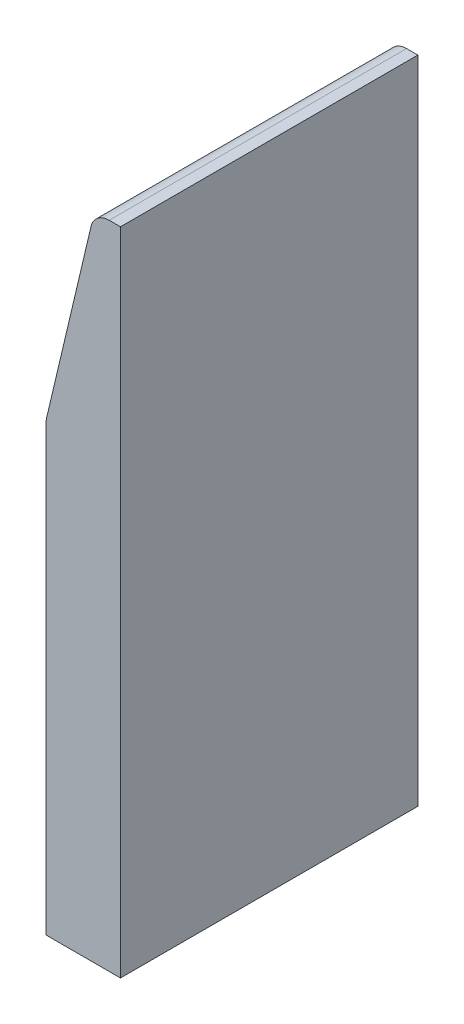
ISO-10303-21;
HEADER;
FILE_DESCRIPTION(('STEP AP214'),'2;1');
FILE_NAME('part.step','',(''),(''),'','','');
FILE_SCHEMA(('AUTOMOTIVE_DESIGN { 1 0 10303 214 1 1 1 1 }'));
ENDSEC;
DATA;
#1=APPLICATION_CONTEXT('core data for automotive mechanical design processes');
#2=APPLICATION_PROTOCOL_DEFINITION('international standard','automotive_design',2000,#1);
#3=PRODUCT_CONTEXT('',#1,'mechanical');
#4=PRODUCT('Part','Part','',(#3));
#5=PRODUCT_RELATED_PRODUCT_CATEGORY('part','',(#4));
#6=PRODUCT_DEFINITION_FORMATION('','',#4);
#7=PRODUCT_DEFINITION_CONTEXT('part definition',#1,'design');
#8=PRODUCT_DEFINITION('design','',#6,#7);
#9=PRODUCT_DEFINITION_SHAPE('','',#8);
#10=(LENGTH_UNIT() NAMED_UNIT(*) SI_UNIT(.MILLI.,.METRE.));
#11=(NAMED_UNIT(*) PLANE_ANGLE_UNIT() SI_UNIT($,.RADIAN.));
#12=(NAMED_UNIT(*) SI_UNIT($,.STERADIAN.) SOLID_ANGLE_UNIT());
#13=UNCERTAINTY_MEASURE_WITH_UNIT(LENGTH_MEASURE(1.E-05),#10,'distance_accuracy_value','');
#14=(GEOMETRIC_REPRESENTATION_CONTEXT(3) GLOBAL_UNCERTAINTY_ASSIGNED_CONTEXT((#13)) GLOBAL_UNIT_ASSIGNED_CONTEXT((#10,
#11,#12)) REPRESENTATION_CONTEXT('',''));
#15=CARTESIAN_POINT('',(0.,0.,0.));
#16=DIRECTION('',(0.,0.,1.));
#17=DIRECTION('',(1.,0.,0.));
#18=AXIS2_PLACEMENT_3D('',#15,#16,#17);
#19=CARTESIAN_POINT('',(20.0000000000002,0.,40.));
#20=DIRECTION('',(0.,1.,0.));
#21=DIRECTION('',(-1.,0.,0.));
#22=AXIS2_PLACEMENT_3D('',#19,#20,#21);
#23=PLANE('',#22);
#24=DIRECTION('',(-1.,0.,0.));
#25=VECTOR('',#24,1.);
#26=CARTESIAN_POINT('',(20.0000000000001,0.,35.0000000000001));
#27=LINE('',#26,#25);
#28=CARTESIAN_POINT('',(15.0000000000001,0.,35.0000000000001));
#29=VERTEX_POINT('',#28);
#30=CARTESIAN_POINT('',(5.00000000000012,0.,35.0000000000001));
#31=VERTEX_POINT('',#30);
#32=EDGE_CURVE('E158',#29,#31,#27,.T.);
#33=ORIENTED_EDGE('',*,*,#32,.T.);
#34=DIRECTION('',(0.,0.,-1.));
#35=VECTOR('',#34,1.);
#36=CARTESIAN_POINT('',(5.00000000000017,0.,40.));
#37=LINE('',#36,#35);
#38=CARTESIAN_POINT('',(5.00000000000003,0.,-35.0000000000001));
#39=VERTEX_POINT('',#38);
#40=EDGE_CURVE('E160',#31,#39,#37,.T.);
#41=ORIENTED_EDGE('',*,*,#40,.T.);
#42=DIRECTION('',(1.,0.,0.));
#43=VECTOR('',#42,1.);
#44=CARTESIAN_POINT('',(20.,0.,-35.0000000000001));
#45=LINE('',#44,#43);
#46=CARTESIAN_POINT('',(15.,0.,-35.0000000000001));
#47=VERTEX_POINT('',#46);
#48=EDGE_CURVE('E138',#39,#47,#45,.T.);
#49=ORIENTED_EDGE('',*,*,#48,.T.);
#50=DIRECTION('',(0.,0.,1.));
#51=VECTOR('',#50,1.);
#52=CARTESIAN_POINT('',(15.0000000000002,0.,40.));
#53=LINE('',#52,#51);
#54=EDGE_CURVE('E156',#47,#29,#53,.T.);
#55=ORIENTED_EDGE('',*,*,#54,.T.);
#56=EDGE_LOOP('',(#33,#41,#49,#55));
#57=FACE_BOUND('',#56,.T.);
#58=ADVANCED_FACE('F49',(#57),#23,.F.);
#59=CARTESIAN_POINT('',(20.0000000000002,180.,40.));
#60=DIRECTION('',(-1.,0.,0.));
#61=DIRECTION('',(0.,-1.,0.));
#62=AXIS2_PLACEMENT_3D('',#59,#60,#61);
#63=PLANE('',#62);
#64=DIRECTION('',(0.,1.,0.));
#65=VECTOR('',#64,1.);
#66=CARTESIAN_POINT('',(20.0000000000002,180.,40.));
#67=LINE('',#66,#65);
#68=CARTESIAN_POINT('',(20.0000000000002,5.00000000000012,40.));
#69=VERTEX_POINT('',#68);
#70=CARTESIAN_POINT('',(20.0000000000002,180.,40.));
#71=VERTEX_POINT('',#70);
#72=EDGE_CURVE('E121',#69,#71,#67,.T.);
#73=ORIENTED_EDGE('',*,*,#72,.F.);
#74=DIRECTION('',(0.,0.,-1.));
#75=VECTOR('',#74,1.);
#76=CARTESIAN_POINT('',(20.0000000000002,5.00000000000006,40.));
#77=LINE('',#76,#75);
#78=CARTESIAN_POINT('',(20.,5.00000000000012,-40.));
#79=VERTEX_POINT('',#78);
#80=EDGE_CURVE('E167',#69,#79,#77,.T.);
#81=ORIENTED_EDGE('',*,*,#80,.T.);
#82=DIRECTION('',(0.,1.,0.));
#83=VECTOR('',#82,1.);
#84=CARTESIAN_POINT('',(20.0000000000001,180.,-40.));
#85=LINE('',#84,#83);
#86=CARTESIAN_POINT('',(20.0000000000001,180.,-40.));
#87=VERTEX_POINT('',#86);
#88=EDGE_CURVE('E136',#79,#87,#85,.T.);
#89=ORIENTED_EDGE('',*,*,#88,.T.);
#90=DIRECTION('',(0.,0.,-1.));
#91=VECTOR('',#90,1.);
#92=CARTESIAN_POINT('',(20.0000000000002,180.,40.));
#93=LINE('',#92,#91);
#94=EDGE_CURVE('E133',#71,#87,#93,.T.);
#95=ORIENTED_EDGE('',*,*,#94,.F.);
#96=EDGE_LOOP('',(#73,#81,#89,#95));
#97=FACE_BOUND('',#96,.T.);
#98=ADVANCED_FACE('F134',(#97),#63,.F.);
#99=CARTESIAN_POINT('',(13.0000000000002,180.,40.));
#100=DIRECTION('',(0.,-1.,0.));
#101=DIRECTION('',(0.,0.,-1.));
#102=AXIS2_PLACEMENT_3D('',#99,#100,#101);
#103=PLANE('',#102);
#104=DIRECTION('',(-1.,0.,0.));
#105=VECTOR('',#104,1.);
#106=CARTESIAN_POINT('',(13.0000000000001,180.,-40.));
#107=LINE('',#106,#105);
#108=CARTESIAN_POINT('',(16.9559531457983,180.,-40.));
#109=VERTEX_POINT('',#108);
#110=EDGE_CURVE('E148',#87,#109,#107,.T.);
#111=ORIENTED_EDGE('',*,*,#110,.T.);
#112=DIRECTION('',(0.,0.,-1.));
#113=VECTOR('',#112,1.);
#114=CARTESIAN_POINT('',(16.9559531457983,180.,40.));
#115=LINE('',#114,#113);
#116=CARTESIAN_POINT('',(16.9559531457983,180.,40.));
#117=VERTEX_POINT('',#116);
#118=EDGE_CURVE('E72',#109,#117,#115,.F.);
#119=ORIENTED_EDGE('',*,*,#118,.T.);
#120=DIRECTION('',(-1.,0.,0.));
#121=VECTOR('',#120,1.);
#122=CARTESIAN_POINT('',(13.0000000000002,180.,40.));
#123=LINE('',#122,#121);
#124=EDGE_CURVE('E124',#71,#117,#123,.T.);
#125=ORIENTED_EDGE('',*,*,#124,.F.);
#126=ORIENTED_EDGE('',*,*,#94,.T.);
#127=EDGE_LOOP('',(#111,#119,#125,#126));
#128=FACE_BOUND('',#127,.T.);
#129=ADVANCED_FACE('F141',(#128),#103,.F.);
#130=CARTESIAN_POINT('',(2.22044604925031E-13,125.,40.0000000000001));
#131=DIRECTION('',(0.97318461277641,-0.23002545392897,0.));
#132=DIRECTION('',(0.23002545392897,0.97318461277641,0.));
#133=AXIS2_PLACEMENT_3D('',#130,#131,#132);
#134=PLANE('',#133);
#135=DIRECTION('',(-0.23002545392897,-0.97318461277641,0.));
#136=VECTOR('',#135,1.);
#137=CARTESIAN_POINT('',(2.22044604925031E-13,125.,40.0000000000001));
#138=LINE('',#137,#136);
#139=CARTESIAN_POINT('',(12.0900300819163,176.150127269645,40.0000000000001));
#140=VERTEX_POINT('',#139);
#141=CARTESIAN_POINT('',(0.134076936118117,125.567248575883,40.0000000000001));
#142=VERTEX_POINT('',#141);
#143=EDGE_CURVE('E142',#140,#142,#138,.T.);
#144=ORIENTED_EDGE('',*,*,#143,.F.);
#145=DIRECTION('',(0.,0.,-1.));
#146=VECTOR('',#145,1.);
#147=CARTESIAN_POINT('',(12.0900300819163,176.150127269645,40.0000000000001));
#148=LINE('',#147,#146);
#149=CARTESIAN_POINT('',(12.0900300819161,176.150127269645,-39.9999999999999));
#150=VERTEX_POINT('',#149);
#151=EDGE_CURVE('E184',#140,#150,#148,.T.);
#152=ORIENTED_EDGE('',*,*,#151,.T.);
#153=DIRECTION('',(-0.23002545392897,-0.97318461277641,0.));
#154=VECTOR('',#153,1.);
#155=CARTESIAN_POINT('',(0.,125.,-39.9999999999999));
#156=LINE('',#155,#154);
#157=CARTESIAN_POINT('',(0.13407693611795,125.567248575883,-39.9999999999999));
#158=VERTEX_POINT('',#157);
#159=EDGE_CURVE('E151',#150,#158,#156,.T.);
#160=ORIENTED_EDGE('',*,*,#159,.T.);
#161=DIRECTION('',(0.,0.,-1.));
#162=VECTOR('',#161,1.);
#163=CARTESIAN_POINT('',(0.134076936118117,125.567248575883,40.0000000000001));
#164=LINE('',#163,#162);
#165=EDGE_CURVE('E172',#158,#142,#164,.F.);
#166=ORIENTED_EDGE('',*,*,#165,.T.);
#167=EDGE_LOOP('',(#144,#152,#160,#166));
#168=FACE_BOUND('',#167,.T.);
#169=ADVANCED_FACE('F196',(#168),#134,.F.);
#170=CARTESIAN_POINT('',(1.66533453693773E-13,0.,40.));
#171=DIRECTION('',(1.,0.,0.));
#172=DIRECTION('',(0.,0.,-1.));
#173=AXIS2_PLACEMENT_3D('',#170,#171,#172);
#174=PLANE('',#173);
#175=DIRECTION('',(0.,-1.,0.));
#176=VECTOR('',#175,1.);
#177=CARTESIAN_POINT('',(1.66533453693773E-13,0.,40.));
#178=LINE('',#177,#176);
#179=CARTESIAN_POINT('',(1.66533453693773E-13,124.417121306238,40.));
#180=VERTEX_POINT('',#179);
#181=CARTESIAN_POINT('',(1.66533453693773E-13,5.,40.));
#182=VERTEX_POINT('',#181);
#183=EDGE_CURVE('E139',#180,#182,#178,.T.);
#184=ORIENTED_EDGE('',*,*,#183,.F.);
#185=DIRECTION('',(0.,0.,-1.));
#186=VECTOR('',#185,1.);
#187=CARTESIAN_POINT('',(1.66533453693774E-13,124.417121306238,40.));
#188=LINE('',#187,#186);
#189=CARTESIAN_POINT('',(0.,124.417121306238,-40.));
#190=VERTEX_POINT('',#189);
#191=EDGE_CURVE('E12',#180,#190,#188,.T.);
#192=ORIENTED_EDGE('',*,*,#191,.T.);
#193=DIRECTION('',(0.,-1.,0.));
#194=VECTOR('',#193,1.);
#195=CARTESIAN_POINT('',(0.,0.,-40.));
#196=LINE('',#195,#194);
#197=CARTESIAN_POINT('',(0.,5.00000000000006,-40.));
#198=VERTEX_POINT('',#197);
#199=EDGE_CURVE('E130',#190,#198,#196,.T.);
#200=ORIENTED_EDGE('',*,*,#199,.T.);
#201=DIRECTION('',(0.,0.,1.));
#202=VECTOR('',#201,1.);
#203=CARTESIAN_POINT('',(1.66533453693773E-13,5.,40.));
#204=LINE('',#203,#202);
#205=EDGE_CURVE('E163',#198,#182,#204,.T.);
#206=ORIENTED_EDGE('',*,*,#205,.T.);
#207=EDGE_LOOP('',(#184,#192,#200,#206));
#208=FACE_BOUND('',#207,.T.);
#209=ADVANCED_FACE('F206',(#208),#174,.F.);
#210=CARTESIAN_POINT('',(1.66533453693773E-13,0.,40.));
#211=DIRECTION('',(0.,0.,-1.));
#212=DIRECTION('',(-1.,0.,0.));
#213=AXIS2_PLACEMENT_3D('',#210,#211,#212);
#214=PLANE('',#213);
#215=ORIENTED_EDGE('',*,*,#124,.T.);
#216=CARTESIAN_POINT('',(16.9559531457983,175.,40.));
#217=DIRECTION('',(0.,0.,-1.));
#218=DIRECTION('',(-1.,0.,0.));
#219=AXIS2_PLACEMENT_3D('',#216,#217,#218);
#220=CIRCLE('',#219,5.);
#221=EDGE_CURVE('E57',#117,#140,#220,.F.);
#222=ORIENTED_EDGE('',*,*,#221,.T.);
#223=ORIENTED_EDGE('',*,*,#143,.T.);
#224=CARTESIAN_POINT('',(5.00000000000017,124.417121306238,40.));
#225=DIRECTION('',(0.,0.,-1.));
#226=DIRECTION('',(-1.,0.,0.));
#227=AXIS2_PLACEMENT_3D('',#224,#225,#226);
#228=CIRCLE('',#227,5.);
#229=EDGE_CURVE('E64',#142,#180,#228,.F.);
#230=ORIENTED_EDGE('',*,*,#229,.T.);
#231=ORIENTED_EDGE('',*,*,#183,.T.);
#232=DIRECTION('',(1.,0.,0.));
#233=VECTOR('',#232,1.);
#234=CARTESIAN_POINT('',(1.66533453693773E-13,5.,40.));
#235=LINE('',#234,#233);
#236=EDGE_CURVE('E127',#182,#69,#235,.T.);
#237=ORIENTED_EDGE('',*,*,#236,.T.);
#238=ORIENTED_EDGE('',*,*,#72,.T.);
#239=EDGE_LOOP('',(#215,#222,#223,#230,#231,#237,#238));
#240=FACE_BOUND('',#239,.T.);
#241=ADVANCED_FACE('F123',(#240),#214,.F.);
#242=CARTESIAN_POINT('',(0.,0.,-40.));
#243=DIRECTION('',(0.,0.,-1.));
#244=DIRECTION('',(-1.,0.,0.));
#245=AXIS2_PLACEMENT_3D('',#242,#243,#244);
#246=PLANE('',#245);
#247=ORIENTED_EDGE('',*,*,#159,.F.);
#248=CARTESIAN_POINT('',(16.9559531457983,175.,-40.));
#249=DIRECTION('',(0.,0.,-1.));
#250=DIRECTION('',(-1.,0.,0.));
#251=AXIS2_PLACEMENT_3D('',#248,#249,#250);
#252=CIRCLE('',#251,5.);
#253=EDGE_CURVE('E189',#150,#109,#252,.T.);
#254=ORIENTED_EDGE('',*,*,#253,.T.);
#255=ORIENTED_EDGE('',*,*,#110,.F.);
#256=ORIENTED_EDGE('',*,*,#88,.F.);
#257=DIRECTION('',(-1.,0.,0.));
#258=VECTOR('',#257,1.);
#259=CARTESIAN_POINT('',(0.,5.00000000000006,-40.));
#260=LINE('',#259,#258);
#261=EDGE_CURVE('E169',#79,#198,#260,.T.);
#262=ORIENTED_EDGE('',*,*,#261,.T.);
#263=ORIENTED_EDGE('',*,*,#199,.F.);
#264=CARTESIAN_POINT('',(5.00000000000017,124.417121306238,-40.));
#265=DIRECTION('',(0.,0.,-1.));
#266=DIRECTION('',(-1.,0.,0.));
#267=AXIS2_PLACEMENT_3D('',#264,#265,#266);
#268=CIRCLE('',#267,5.);
#269=EDGE_CURVE('E187',#190,#158,#268,.T.);
#270=ORIENTED_EDGE('',*,*,#269,.T.);
#271=EDGE_LOOP('',(#247,#254,#255,#256,#262,#263,#270));
#272=FACE_BOUND('',#271,.T.);
#273=ADVANCED_FACE('F201',(#272),#246,.T.);
#274=CARTESIAN_POINT('',(20.0000000000002,5.00000000000006,40.));
#275=DIRECTION('',(-0.707106781186548,0.707106781186547,0.));
#276=DIRECTION('',(0.,0.,-1.));
#277=AXIS2_PLACEMENT_3D('',#274,#275,#276);
#278=PLANE('',#277);
#279=DIRECTION('',(0.577350269189626,0.577350269189626,-0.577350269189626));
#280=VECTOR('',#279,1.);
#281=CARTESIAN_POINT('',(16.6666666666668,1.66666666666672,-36.6666666666666));
#282=LINE('',#281,#280);
#283=EDGE_CURVE('E178',#79,#47,#282,.F.);
#284=ORIENTED_EDGE('',*,*,#283,.F.);
#285=ORIENTED_EDGE('',*,*,#80,.F.);
#286=DIRECTION('',(-0.577350269189626,-0.577350269189626,-0.577350269189626));
#287=VECTOR('',#286,1.);
#288=CARTESIAN_POINT('',(20.0000000000002,5.00000000000006,40.));
#289=LINE('',#288,#287);
#290=EDGE_CURVE('E149',#29,#69,#289,.F.);
#291=ORIENTED_EDGE('',*,*,#290,.F.);
#292=ORIENTED_EDGE('',*,*,#54,.F.);
#293=EDGE_LOOP('',(#284,#285,#291,#292));
#294=FACE_BOUND('',#293,.T.);
#295=ADVANCED_FACE('F225',(#294),#278,.F.);
#296=CARTESIAN_POINT('',(1.66533453693773E-13,5.,40.));
#297=DIRECTION('',(0.,0.707106781186547,-0.707106781186547));
#298=DIRECTION('',(1.,0.,0.));
#299=AXIS2_PLACEMENT_3D('',#296,#297,#298);
#300=PLANE('',#299);
#301=ORIENTED_EDGE('',*,*,#290,.T.);
#302=ORIENTED_EDGE('',*,*,#236,.F.);
#303=DIRECTION('',(0.577350269189626,-0.577350269189626,-0.577350269189626));
#304=VECTOR('',#303,1.);
#305=CARTESIAN_POINT('',(1.66533453693773E-13,5.,40.));
#306=LINE('',#305,#304);
#307=EDGE_CURVE('E175',#31,#182,#306,.F.);
#308=ORIENTED_EDGE('',*,*,#307,.F.);
#309=ORIENTED_EDGE('',*,*,#32,.F.);
#310=EDGE_LOOP('',(#301,#302,#308,#309));
#311=FACE_BOUND('',#310,.T.);
#312=ADVANCED_FACE('F223',(#311),#300,.F.);
#313=CARTESIAN_POINT('',(20.,0.,-35.0000000000001));
#314=DIRECTION('',(0.,-0.707106781186547,-0.707106781186547));
#315=DIRECTION('',(-1.,0.,0.));
#316=AXIS2_PLACEMENT_3D('',#313,#314,#315);
#317=PLANE('',#316);
#318=ORIENTED_EDGE('',*,*,#283,.T.);
#319=ORIENTED_EDGE('',*,*,#48,.F.);
#320=DIRECTION('',(0.577350269189626,-0.577350269189626,0.577350269189626));
#321=VECTOR('',#320,1.);
#322=CARTESIAN_POINT('',(10.0000000000002,-4.99999999999996,-29.9999999999998));
#323=LINE('',#322,#321);
#324=EDGE_CURVE('E173',#198,#39,#323,.T.);
#325=ORIENTED_EDGE('',*,*,#324,.F.);
#326=ORIENTED_EDGE('',*,*,#261,.F.);
#327=EDGE_LOOP('',(#318,#319,#325,#326));
#328=FACE_BOUND('',#327,.T.);
#329=ADVANCED_FACE('F217',(#328),#317,.T.);
#330=CARTESIAN_POINT('',(5.00000000000017,0.,40.));
#331=DIRECTION('',(0.707106781186547,0.707106781186547,0.));
#332=DIRECTION('',(0.,0.,-1.));
#333=AXIS2_PLACEMENT_3D('',#330,#331,#332);
#334=PLANE('',#333);
#335=ORIENTED_EDGE('',*,*,#307,.T.);
#336=ORIENTED_EDGE('',*,*,#205,.F.);
#337=ORIENTED_EDGE('',*,*,#324,.T.);
#338=ORIENTED_EDGE('',*,*,#40,.F.);
#339=EDGE_LOOP('',(#335,#336,#337,#338));
#340=FACE_BOUND('',#339,.T.);
#341=ADVANCED_FACE('F213',(#340),#334,.F.);
#342=CARTESIAN_POINT('',(16.9559531457983,175.,40.0000000000001));
#343=DIRECTION('',(0.,0.,-1.));
#344=DIRECTION('',(-1.,0.,0.));
#345=AXIS2_PLACEMENT_3D('',#342,#343,#344);
#346=CYLINDRICAL_SURFACE('',#345,5.);
#347=ORIENTED_EDGE('',*,*,#221,.F.);
#348=ORIENTED_EDGE('',*,*,#118,.F.);
#349=ORIENTED_EDGE('',*,*,#253,.F.);
#350=ORIENTED_EDGE('',*,*,#151,.F.);
#351=EDGE_LOOP('',(#347,#348,#349,#350));
#352=FACE_BOUND('',#351,.T.);
#353=ADVANCED_FACE('F199',(#352),#346,.T.);
#354=CARTESIAN_POINT('',(5.00000000000017,124.417121306238,40.));
#355=DIRECTION('',(0.,0.,-1.));
#356=DIRECTION('',(-1.,0.,0.));
#357=AXIS2_PLACEMENT_3D('',#354,#355,#356);
#358=CYLINDRICAL_SURFACE('',#357,5.);
#359=ORIENTED_EDGE('',*,*,#229,.F.);
#360=ORIENTED_EDGE('',*,*,#165,.F.);
#361=ORIENTED_EDGE('',*,*,#269,.F.);
#362=ORIENTED_EDGE('',*,*,#191,.F.);
#363=EDGE_LOOP('',(#359,#360,#361,#362));
#364=FACE_BOUND('',#363,.T.);
#365=ADVANCED_FACE('F51',(#364),#358,.T.);
#366=CLOSED_SHELL('',(#58,#98,#129,#169,#209,#241,#273,#295,#312,#329,#341,#353,#365));
#367=MANIFOLD_SOLID_BREP('B2',#366);
#368=ADVANCED_BREP_SHAPE_REPRESENTATION('',(#18,#367),#14);
#369=SHAPE_DEFINITION_REPRESENTATION(#9,#368);
ENDSEC;
END-ISO-10303-21;
